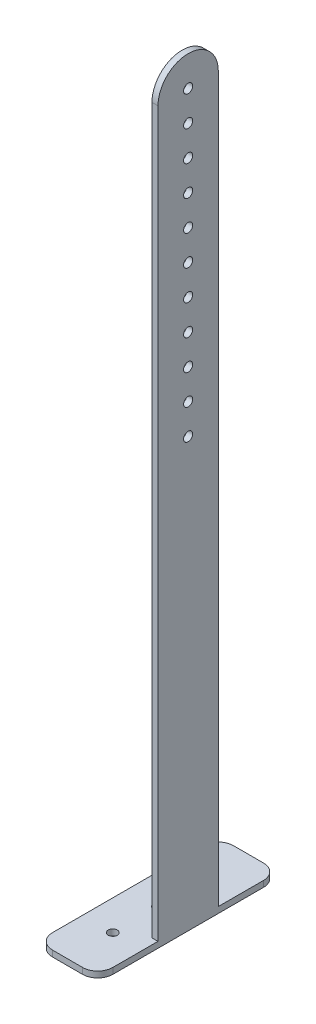
ISO-10303-21;
HEADER;
FILE_DESCRIPTION(('STEP AP214'),'2;1');
FILE_NAME('part.step','',(''),(''),'','','');
FILE_SCHEMA(('AUTOMOTIVE_DESIGN { 1 0 10303 214 1 1 1 1 }'));
ENDSEC;
DATA;
#1=APPLICATION_CONTEXT('core data for automotive mechanical design processes');
#2=APPLICATION_PROTOCOL_DEFINITION('international standard','automotive_design',2000,#1);
#3=PRODUCT_CONTEXT('',#1,'mechanical');
#4=PRODUCT('Part','Part','',(#3));
#5=PRODUCT_RELATED_PRODUCT_CATEGORY('part','',(#4));
#6=PRODUCT_DEFINITION_FORMATION('','',#4);
#7=PRODUCT_DEFINITION_CONTEXT('part definition',#1,'design');
#8=PRODUCT_DEFINITION('design','',#6,#7);
#9=PRODUCT_DEFINITION_SHAPE('','',#8);
#10=(LENGTH_UNIT() NAMED_UNIT(*) SI_UNIT(.MILLI.,.METRE.));
#11=(NAMED_UNIT(*) PLANE_ANGLE_UNIT() SI_UNIT($,.RADIAN.));
#12=(NAMED_UNIT(*) SI_UNIT($,.STERADIAN.) SOLID_ANGLE_UNIT());
#13=UNCERTAINTY_MEASURE_WITH_UNIT(LENGTH_MEASURE(1.E-05),#10,'distance_accuracy_value','');
#14=(GEOMETRIC_REPRESENTATION_CONTEXT(3) GLOBAL_UNCERTAINTY_ASSIGNED_CONTEXT((#13)) GLOBAL_UNIT_ASSIGNED_CONTEXT((#10,
#11,#12)) REPRESENTATION_CONTEXT('',''));
#15=CARTESIAN_POINT('',(0.,0.,0.));
#16=DIRECTION('',(0.,0.,1.));
#17=DIRECTION('',(1.,0.,0.));
#18=AXIS2_PLACEMENT_3D('',#15,#16,#17);
#19=CARTESIAN_POINT('',(0.,240.,10.));
#20=DIRECTION('',(-1.,0.,0.));
#21=DIRECTION('',(0.,0.,1.));
#22=AXIS2_PLACEMENT_3D('',#19,#20,#21);
#23=CYLINDRICAL_SURFACE('',#22,10.);
#24=DIRECTION('',(1.,0.,0.));
#25=VECTOR('',#24,1.);
#26=CARTESIAN_POINT('',(0.,240.,0.));
#27=LINE('',#26,#25);
#28=CARTESIAN_POINT('',(0.,240.,0.));
#29=VERTEX_POINT('',#28);
#30=CARTESIAN_POINT('',(2.,240.,0.));
#31=VERTEX_POINT('',#30);
#32=EDGE_CURVE('E190',#29,#31,#27,.T.);
#33=ORIENTED_EDGE('',*,*,#32,.F.);
#34=CARTESIAN_POINT('',(0.,240.,10.));
#35=DIRECTION('',(1.,0.,0.));
#36=DIRECTION('',(0.,0.,-1.));
#37=AXIS2_PLACEMENT_3D('',#34,#35,#36);
#38=CIRCLE('',#37,10.);
#39=CARTESIAN_POINT('',(0.,240.,20.));
#40=VERTEX_POINT('',#39);
#41=EDGE_CURVE('E47',#40,#29,#38,.F.);
#42=ORIENTED_EDGE('',*,*,#41,.F.);
#43=DIRECTION('',(-1.,0.,0.));
#44=VECTOR('',#43,1.);
#45=CARTESIAN_POINT('',(0.,240.,20.));
#46=LINE('',#45,#44);
#47=CARTESIAN_POINT('',(2.,240.,20.));
#48=VERTEX_POINT('',#47);
#49=EDGE_CURVE('E192',#48,#40,#46,.T.);
#50=ORIENTED_EDGE('',*,*,#49,.F.);
#51=CARTESIAN_POINT('',(2.,240.,10.));
#52=DIRECTION('',(-1.,0.,0.));
#53=DIRECTION('',(0.,0.,1.));
#54=AXIS2_PLACEMENT_3D('',#51,#52,#53);
#55=CIRCLE('',#54,10.);
#56=EDGE_CURVE('E11',#31,#48,#55,.F.);
#57=ORIENTED_EDGE('',*,*,#56,.F.);
#58=EDGE_LOOP('',(#33,#42,#50,#57));
#59=FACE_BOUND('',#58,.T.);
#60=ADVANCED_FACE('F39',(#59),#23,.T.);
#61=CARTESIAN_POINT('',(2.,250.,20.));
#62=DIRECTION('',(-1.,0.,0.));
#63=DIRECTION('',(0.,0.,1.));
#64=AXIS2_PLACEMENT_3D('',#61,#62,#63);
#65=PLANE('',#64);
#66=CARTESIAN_POINT('',(2.,240.,10.));
#67=DIRECTION('',(-1.,0.,0.));
#68=DIRECTION('',(0.,0.,1.));
#69=AXIS2_PLACEMENT_3D('',#66,#67,#68);
#70=CIRCLE('',#69,1.51);
#71=CARTESIAN_POINT('',(2.,240.,11.51));
#72=VERTEX_POINT('',#71);
#73=EDGE_CURVE('E228',#72,#72,#70,.T.);
#74=ORIENTED_EDGE('',*,*,#73,.T.);
#75=EDGE_LOOP('',(#74));
#76=FACE_BOUND('',#75,.T.);
#77=CARTESIAN_POINT('',(2.,230.,10.0000000000001));
#78=DIRECTION('',(-1.,0.,0.));
#79=DIRECTION('',(0.,0.,1.));
#80=AXIS2_PLACEMENT_3D('',#77,#78,#79);
#81=CIRCLE('',#80,1.51);
#82=CARTESIAN_POINT('',(2.,230.,11.5100000000001));
#83=VERTEX_POINT('',#82);
#84=EDGE_CURVE('E299',#83,#83,#81,.T.);
#85=ORIENTED_EDGE('',*,*,#84,.T.);
#86=EDGE_LOOP('',(#85));
#87=FACE_BOUND('',#86,.T.);
#88=CARTESIAN_POINT('',(2.,220.,10.0000000000002));
#89=DIRECTION('',(-1.,0.,0.));
#90=DIRECTION('',(0.,0.,1.));
#91=AXIS2_PLACEMENT_3D('',#88,#89,#90);
#92=CIRCLE('',#91,1.51);
#93=CARTESIAN_POINT('',(2.,220.,11.5100000000002));
#94=VERTEX_POINT('',#93);
#95=EDGE_CURVE('E293',#94,#94,#92,.T.);
#96=ORIENTED_EDGE('',*,*,#95,.T.);
#97=EDGE_LOOP('',(#96));
#98=FACE_BOUND('',#97,.T.);
#99=CARTESIAN_POINT('',(2.,210.,10.0000000000003));
#100=DIRECTION('',(-1.,0.,0.));
#101=DIRECTION('',(0.,0.,1.));
#102=AXIS2_PLACEMENT_3D('',#99,#100,#101);
#103=CIRCLE('',#102,1.51);
#104=CARTESIAN_POINT('',(2.,210.,11.5100000000003));
#105=VERTEX_POINT('',#104);
#106=EDGE_CURVE('E287',#105,#105,#103,.T.);
#107=ORIENTED_EDGE('',*,*,#106,.T.);
#108=EDGE_LOOP('',(#107));
#109=FACE_BOUND('',#108,.T.);
#110=CARTESIAN_POINT('',(2.,200.,10.000000000001));
#111=DIRECTION('',(-1.,0.,0.));
#112=DIRECTION('',(0.,0.,1.));
#113=AXIS2_PLACEMENT_3D('',#110,#111,#112);
#114=CIRCLE('',#113,1.51);
#115=CARTESIAN_POINT('',(2.,200.,11.510000000001));
#116=VERTEX_POINT('',#115);
#117=EDGE_CURVE('E281',#116,#116,#114,.T.);
#118=ORIENTED_EDGE('',*,*,#117,.T.);
#119=EDGE_LOOP('',(#118));
#120=FACE_BOUND('',#119,.T.);
#121=CARTESIAN_POINT('',(2.,190.,10.0000000000012));
#122=DIRECTION('',(-1.,0.,0.));
#123=DIRECTION('',(0.,0.,1.));
#124=AXIS2_PLACEMENT_3D('',#121,#122,#123);
#125=CIRCLE('',#124,1.51);
#126=CARTESIAN_POINT('',(2.,190.,11.5100000000012));
#127=VERTEX_POINT('',#126);
#128=EDGE_CURVE('E275',#127,#127,#125,.T.);
#129=ORIENTED_EDGE('',*,*,#128,.T.);
#130=EDGE_LOOP('',(#129));
#131=FACE_BOUND('',#130,.T.);
#132=CARTESIAN_POINT('',(2.,180.,10.0000000000015));
#133=DIRECTION('',(-1.,0.,0.));
#134=DIRECTION('',(0.,0.,1.));
#135=AXIS2_PLACEMENT_3D('',#132,#133,#134);
#136=CIRCLE('',#135,1.51);
#137=CARTESIAN_POINT('',(2.,180.,11.5100000000015));
#138=VERTEX_POINT('',#137);
#139=EDGE_CURVE('E269',#138,#138,#136,.T.);
#140=ORIENTED_EDGE('',*,*,#139,.T.);
#141=EDGE_LOOP('',(#140));
#142=FACE_BOUND('',#141,.T.);
#143=CARTESIAN_POINT('',(2.,170.,10.0000000000027));
#144=DIRECTION('',(-1.,0.,0.));
#145=DIRECTION('',(0.,0.,1.));
#146=AXIS2_PLACEMENT_3D('',#143,#144,#145);
#147=CIRCLE('',#146,1.50999999999999);
#148=CARTESIAN_POINT('',(2.,170.,11.5100000000027));
#149=VERTEX_POINT('',#148);
#150=EDGE_CURVE('E263',#149,#149,#147,.T.);
#151=ORIENTED_EDGE('',*,*,#150,.T.);
#152=EDGE_LOOP('',(#151));
#153=FACE_BOUND('',#152,.T.);
#154=CARTESIAN_POINT('',(2.,160.,10.0000000000031));
#155=DIRECTION('',(-1.,0.,0.));
#156=DIRECTION('',(0.,0.,1.));
#157=AXIS2_PLACEMENT_3D('',#154,#155,#156);
#158=CIRCLE('',#157,1.51);
#159=CARTESIAN_POINT('',(2.,160.,11.5100000000031));
#160=VERTEX_POINT('',#159);
#161=EDGE_CURVE('E257',#160,#160,#158,.T.);
#162=ORIENTED_EDGE('',*,*,#161,.T.);
#163=EDGE_LOOP('',(#162));
#164=FACE_BOUND('',#163,.T.);
#165=CARTESIAN_POINT('',(2.,150.,10.0000000000035));
#166=DIRECTION('',(-1.,0.,0.));
#167=DIRECTION('',(0.,0.,1.));
#168=AXIS2_PLACEMENT_3D('',#165,#166,#167);
#169=CIRCLE('',#168,1.51);
#170=CARTESIAN_POINT('',(2.,150.,11.5100000000035));
#171=VERTEX_POINT('',#170);
#172=EDGE_CURVE('E251',#171,#171,#169,.T.);
#173=ORIENTED_EDGE('',*,*,#172,.T.);
#174=EDGE_LOOP('',(#173));
#175=FACE_BOUND('',#174,.T.);
#176=CARTESIAN_POINT('',(2.,140.,10.0000000000039));
#177=DIRECTION('',(-1.,0.,0.));
#178=DIRECTION('',(0.,0.,1.));
#179=AXIS2_PLACEMENT_3D('',#176,#177,#178);
#180=CIRCLE('',#179,1.51);
#181=CARTESIAN_POINT('',(2.,140.,11.5100000000039));
#182=VERTEX_POINT('',#181);
#183=EDGE_CURVE('E245',#182,#182,#180,.T.);
#184=ORIENTED_EDGE('',*,*,#183,.T.);
#185=EDGE_LOOP('',(#184));
#186=FACE_BOUND('',#185,.T.);
#187=DIRECTION('',(0.,1.,0.));
#188=VECTOR('',#187,1.);
#189=CARTESIAN_POINT('',(2.,250.,0.));
#190=LINE('',#189,#188);
#191=CARTESIAN_POINT('',(2.,0.,0.));
#192=VERTEX_POINT('',#191);
#193=EDGE_CURVE('E136',#192,#31,#190,.T.);
#194=ORIENTED_EDGE('',*,*,#193,.T.);
#195=ORIENTED_EDGE('',*,*,#56,.T.);
#196=DIRECTION('',(0.,1.,0.));
#197=VECTOR('',#196,1.);
#198=CARTESIAN_POINT('',(2.,250.,20.));
#199=LINE('',#198,#197);
#200=CARTESIAN_POINT('',(2.,0.,20.));
#201=VERTEX_POINT('',#200);
#202=EDGE_CURVE('E154',#201,#48,#199,.T.);
#203=ORIENTED_EDGE('',*,*,#202,.F.);
#204=DIRECTION('',(0.,0.,-1.));
#205=VECTOR('',#204,1.);
#206=CARTESIAN_POINT('',(2.,0.,40.));
#207=LINE('',#206,#205);
#208=CARTESIAN_POINT('',(2.,0.,35.));
#209=VERTEX_POINT('',#208);
#210=EDGE_CURVE('E201',#209,#201,#207,.T.);
#211=ORIENTED_EDGE('',*,*,#210,.F.);
#212=DIRECTION('',(0.,-1.,0.));
#213=VECTOR('',#212,1.);
#214=CARTESIAN_POINT('',(2.,250.,35.));
#215=LINE('',#214,#213);
#216=CARTESIAN_POINT('',(2.,-2.,35.));
#217=VERTEX_POINT('',#216);
#218=EDGE_CURVE('E168',#209,#217,#215,.T.);
#219=ORIENTED_EDGE('',*,*,#218,.T.);
#220=DIRECTION('',(0.,0.,-1.));
#221=VECTOR('',#220,1.);
#222=CARTESIAN_POINT('',(2.,-2.,40.));
#223=LINE('',#222,#221);
#224=CARTESIAN_POINT('',(2.,-2.,-15.));
#225=VERTEX_POINT('',#224);
#226=EDGE_CURVE('E203',#217,#225,#223,.T.);
#227=ORIENTED_EDGE('',*,*,#226,.T.);
#228=DIRECTION('',(0.,-1.,0.));
#229=VECTOR('',#228,1.);
#230=CARTESIAN_POINT('',(2.,0.,-15.));
#231=LINE('',#230,#229);
#232=CARTESIAN_POINT('',(2.,0.,-15.));
#233=VERTEX_POINT('',#232);
#234=EDGE_CURVE('E171',#225,#233,#231,.F.);
#235=ORIENTED_EDGE('',*,*,#234,.T.);
#236=EDGE_CURVE('E197',#192,#233,#207,.T.);
#237=ORIENTED_EDGE('',*,*,#236,.F.);
#238=EDGE_LOOP('',(#194,#195,#203,#211,#219,#227,#235,#237));
#239=FACE_BOUND('',#238,.T.);
#240=ADVANCED_FACE('F196',(#76,#87,#98,#109,#120,#131,#142,#153,#164,#175,#186,#239),#65,.F.);
#241=CARTESIAN_POINT('',(0.,0.,20.));
#242=DIRECTION('',(1.,0.,0.));
#243=DIRECTION('',(0.,0.,-1.));
#244=AXIS2_PLACEMENT_3D('',#241,#242,#243);
#245=PLANE('',#244);
#246=CARTESIAN_POINT('',(0.,240.,10.));
#247=DIRECTION('',(-1.,0.,0.));
#248=DIRECTION('',(0.,0.,1.));
#249=AXIS2_PLACEMENT_3D('',#246,#247,#248);
#250=CIRCLE('',#249,1.51);
#251=CARTESIAN_POINT('',(0.,240.,11.51));
#252=VERTEX_POINT('',#251);
#253=EDGE_CURVE('E302',#252,#252,#250,.T.);
#254=ORIENTED_EDGE('',*,*,#253,.F.);
#255=EDGE_LOOP('',(#254));
#256=FACE_BOUND('',#255,.T.);
#257=CARTESIAN_POINT('',(0.,230.,10.0000000000001));
#258=DIRECTION('',(-1.,0.,0.));
#259=DIRECTION('',(0.,0.,1.));
#260=AXIS2_PLACEMENT_3D('',#257,#258,#259);
#261=CIRCLE('',#260,1.51);
#262=CARTESIAN_POINT('',(0.,230.,11.5100000000001));
#263=VERTEX_POINT('',#262);
#264=EDGE_CURVE('E296',#263,#263,#261,.T.);
#265=ORIENTED_EDGE('',*,*,#264,.F.);
#266=EDGE_LOOP('',(#265));
#267=FACE_BOUND('',#266,.T.);
#268=CARTESIAN_POINT('',(0.,220.,10.0000000000002));
#269=DIRECTION('',(-1.,0.,0.));
#270=DIRECTION('',(0.,0.,1.));
#271=AXIS2_PLACEMENT_3D('',#268,#269,#270);
#272=CIRCLE('',#271,1.51);
#273=CARTESIAN_POINT('',(0.,220.,11.5100000000002));
#274=VERTEX_POINT('',#273);
#275=EDGE_CURVE('E290',#274,#274,#272,.T.);
#276=ORIENTED_EDGE('',*,*,#275,.F.);
#277=EDGE_LOOP('',(#276));
#278=FACE_BOUND('',#277,.T.);
#279=CARTESIAN_POINT('',(0.,210.,10.0000000000003));
#280=DIRECTION('',(-1.,0.,0.));
#281=DIRECTION('',(0.,0.,1.));
#282=AXIS2_PLACEMENT_3D('',#279,#280,#281);
#283=CIRCLE('',#282,1.51);
#284=CARTESIAN_POINT('',(0.,210.,11.5100000000003));
#285=VERTEX_POINT('',#284);
#286=EDGE_CURVE('E284',#285,#285,#283,.T.);
#287=ORIENTED_EDGE('',*,*,#286,.F.);
#288=EDGE_LOOP('',(#287));
#289=FACE_BOUND('',#288,.T.);
#290=CARTESIAN_POINT('',(0.,200.,10.000000000001));
#291=DIRECTION('',(-1.,0.,0.));
#292=DIRECTION('',(0.,0.,1.));
#293=AXIS2_PLACEMENT_3D('',#290,#291,#292);
#294=CIRCLE('',#293,1.51);
#295=CARTESIAN_POINT('',(0.,200.,11.510000000001));
#296=VERTEX_POINT('',#295);
#297=EDGE_CURVE('E278',#296,#296,#294,.T.);
#298=ORIENTED_EDGE('',*,*,#297,.F.);
#299=EDGE_LOOP('',(#298));
#300=FACE_BOUND('',#299,.T.);
#301=CARTESIAN_POINT('',(0.,190.,10.0000000000012));
#302=DIRECTION('',(-1.,0.,0.));
#303=DIRECTION('',(0.,0.,1.));
#304=AXIS2_PLACEMENT_3D('',#301,#302,#303);
#305=CIRCLE('',#304,1.51);
#306=CARTESIAN_POINT('',(0.,190.,11.5100000000012));
#307=VERTEX_POINT('',#306);
#308=EDGE_CURVE('E272',#307,#307,#305,.T.);
#309=ORIENTED_EDGE('',*,*,#308,.F.);
#310=EDGE_LOOP('',(#309));
#311=FACE_BOUND('',#310,.T.);
#312=CARTESIAN_POINT('',(0.,180.,10.0000000000015));
#313=DIRECTION('',(-1.,0.,0.));
#314=DIRECTION('',(0.,0.,1.));
#315=AXIS2_PLACEMENT_3D('',#312,#313,#314);
#316=CIRCLE('',#315,1.51);
#317=CARTESIAN_POINT('',(0.,180.,11.5100000000015));
#318=VERTEX_POINT('',#317);
#319=EDGE_CURVE('E266',#318,#318,#316,.T.);
#320=ORIENTED_EDGE('',*,*,#319,.F.);
#321=EDGE_LOOP('',(#320));
#322=FACE_BOUND('',#321,.T.);
#323=CARTESIAN_POINT('',(0.,170.,10.0000000000027));
#324=DIRECTION('',(-1.,0.,0.));
#325=DIRECTION('',(0.,0.,1.));
#326=AXIS2_PLACEMENT_3D('',#323,#324,#325);
#327=CIRCLE('',#326,1.50999999999999);
#328=CARTESIAN_POINT('',(0.,170.,11.5100000000027));
#329=VERTEX_POINT('',#328);
#330=EDGE_CURVE('E260',#329,#329,#327,.T.);
#331=ORIENTED_EDGE('',*,*,#330,.F.);
#332=EDGE_LOOP('',(#331));
#333=FACE_BOUND('',#332,.T.);
#334=CARTESIAN_POINT('',(0.,160.,10.0000000000031));
#335=DIRECTION('',(-1.,0.,0.));
#336=DIRECTION('',(0.,0.,1.));
#337=AXIS2_PLACEMENT_3D('',#334,#335,#336);
#338=CIRCLE('',#337,1.51);
#339=CARTESIAN_POINT('',(0.,160.,11.5100000000031));
#340=VERTEX_POINT('',#339);
#341=EDGE_CURVE('E254',#340,#340,#338,.T.);
#342=ORIENTED_EDGE('',*,*,#341,.F.);
#343=EDGE_LOOP('',(#342));
#344=FACE_BOUND('',#343,.T.);
#345=CARTESIAN_POINT('',(0.,150.,10.0000000000035));
#346=DIRECTION('',(-1.,0.,0.));
#347=DIRECTION('',(0.,0.,1.));
#348=AXIS2_PLACEMENT_3D('',#345,#346,#347);
#349=CIRCLE('',#348,1.51);
#350=CARTESIAN_POINT('',(0.,150.,11.5100000000035));
#351=VERTEX_POINT('',#350);
#352=EDGE_CURVE('E248',#351,#351,#349,.T.);
#353=ORIENTED_EDGE('',*,*,#352,.F.);
#354=EDGE_LOOP('',(#353));
#355=FACE_BOUND('',#354,.T.);
#356=CARTESIAN_POINT('',(0.,140.,10.0000000000039));
#357=DIRECTION('',(-1.,0.,0.));
#358=DIRECTION('',(0.,0.,1.));
#359=AXIS2_PLACEMENT_3D('',#356,#357,#358);
#360=CIRCLE('',#359,1.51);
#361=CARTESIAN_POINT('',(0.,140.,11.5100000000039));
#362=VERTEX_POINT('',#361);
#363=EDGE_CURVE('E242',#362,#362,#360,.T.);
#364=ORIENTED_EDGE('',*,*,#363,.F.);
#365=EDGE_LOOP('',(#364));
#366=FACE_BOUND('',#365,.T.);
#367=DIRECTION('',(0.,-1.,0.));
#368=VECTOR('',#367,1.);
#369=CARTESIAN_POINT('',(0.,0.,20.));
#370=LINE('',#369,#368);
#371=CARTESIAN_POINT('',(0.,0.,20.));
#372=VERTEX_POINT('',#371);
#373=EDGE_CURVE('E149',#40,#372,#370,.T.);
#374=ORIENTED_EDGE('',*,*,#373,.F.);
#375=ORIENTED_EDGE('',*,*,#41,.T.);
#376=DIRECTION('',(0.,-1.,0.));
#377=VECTOR('',#376,1.);
#378=CARTESIAN_POINT('',(0.,0.,0.));
#379=LINE('',#378,#377);
#380=CARTESIAN_POINT('',(0.,0.,0.));
#381=VERTEX_POINT('',#380);
#382=EDGE_CURVE('E126',#29,#381,#379,.T.);
#383=ORIENTED_EDGE('',*,*,#382,.T.);
#384=DIRECTION('',(0.,0.,-1.));
#385=VECTOR('',#384,1.);
#386=CARTESIAN_POINT('',(0.,0.,20.));
#387=LINE('',#386,#385);
#388=EDGE_CURVE('E131',#372,#381,#387,.T.);
#389=ORIENTED_EDGE('',*,*,#388,.F.);
#390=EDGE_LOOP('',(#374,#375,#383,#389));
#391=FACE_BOUND('',#390,.T.);
#392=ADVANCED_FACE('F129',(#256,#267,#278,#289,#300,#311,#322,#333,#344,#355,#366,#391),#245,.F.);
#393=CARTESIAN_POINT('',(0.,0.,20.));
#394=DIRECTION('',(0.,0.,-1.));
#395=DIRECTION('',(-1.,0.,0.));
#396=AXIS2_PLACEMENT_3D('',#393,#394,#395);
#397=PLANE('',#396);
#398=ORIENTED_EDGE('',*,*,#202,.T.);
#399=ORIENTED_EDGE('',*,*,#49,.T.);
#400=ORIENTED_EDGE('',*,*,#373,.T.);
#401=DIRECTION('',(1.,0.,0.));
#402=VECTOR('',#401,1.);
#403=CARTESIAN_POINT('',(2.,0.,20.));
#404=LINE('',#403,#402);
#405=EDGE_CURVE('E135',#372,#201,#404,.T.);
#406=ORIENTED_EDGE('',*,*,#405,.T.);
#407=EDGE_LOOP('',(#398,#399,#400,#406));
#408=FACE_BOUND('',#407,.T.);
#409=ADVANCED_FACE('F195',(#408),#397,.F.);
#410=CARTESIAN_POINT('',(0.,0.,0.));
#411=DIRECTION('',(0.,0.,-1.));
#412=DIRECTION('',(-1.,0.,0.));
#413=AXIS2_PLACEMENT_3D('',#410,#411,#412);
#414=PLANE('',#413);
#415=ORIENTED_EDGE('',*,*,#382,.F.);
#416=ORIENTED_EDGE('',*,*,#32,.T.);
#417=ORIENTED_EDGE('',*,*,#193,.F.);
#418=DIRECTION('',(1.,0.,0.));
#419=VECTOR('',#418,1.);
#420=CARTESIAN_POINT('',(2.,0.,0.));
#421=LINE('',#420,#419);
#422=EDGE_CURVE('E139',#381,#192,#421,.T.);
#423=ORIENTED_EDGE('',*,*,#422,.F.);
#424=EDGE_LOOP('',(#415,#416,#417,#423));
#425=FACE_BOUND('',#424,.T.);
#426=ADVANCED_FACE('F140',(#425),#414,.T.);
#427=CARTESIAN_POINT('',(-18.,0.,40.));
#428=DIRECTION('',(0.,1.,0.));
#429=DIRECTION('',(0.,0.,1.));
#430=AXIS2_PLACEMENT_3D('',#427,#428,#429);
#431=PLANE('',#430);
#432=CARTESIAN_POINT('',(-8.,0.,25.));
#433=DIRECTION('',(0.,1.,0.));
#434=DIRECTION('',(0.,0.,1.));
#435=AXIS2_PLACEMENT_3D('',#432,#433,#434);
#436=CIRCLE('',#435,1.51);
#437=CARTESIAN_POINT('',(-8.,0.,26.51));
#438=VERTEX_POINT('',#437);
#439=EDGE_CURVE('E237',#438,#438,#436,.T.);
#440=ORIENTED_EDGE('',*,*,#439,.F.);
#441=EDGE_LOOP('',(#440));
#442=FACE_BOUND('',#441,.T.);
#443=CARTESIAN_POINT('',(-8.,0.,10.));
#444=DIRECTION('',(0.,1.,0.));
#445=DIRECTION('',(0.,0.,1.));
#446=AXIS2_PLACEMENT_3D('',#443,#444,#445);
#447=CIRCLE('',#446,1.51);
#448=CARTESIAN_POINT('',(-8.,0.,11.51));
#449=VERTEX_POINT('',#448);
#450=EDGE_CURVE('E231',#449,#449,#447,.T.);
#451=ORIENTED_EDGE('',*,*,#450,.F.);
#452=EDGE_LOOP('',(#451));
#453=FACE_BOUND('',#452,.T.);
#454=CARTESIAN_POINT('',(-8.,0.,-5.));
#455=DIRECTION('',(0.,1.,0.));
#456=DIRECTION('',(0.,0.,-1.));
#457=AXIS2_PLACEMENT_3D('',#454,#455,#456);
#458=CIRCLE('',#457,1.51);
#459=CARTESIAN_POINT('',(-8.,0.,-6.51000000000001));
#460=VERTEX_POINT('',#459);
#461=EDGE_CURVE('E224',#460,#460,#458,.T.);
#462=ORIENTED_EDGE('',*,*,#461,.F.);
#463=EDGE_LOOP('',(#462));
#464=FACE_BOUND('',#463,.T.);
#465=ORIENTED_EDGE('',*,*,#236,.T.);
#466=CARTESIAN_POINT('',(-3.,0.,-15.));
#467=DIRECTION('',(0.,1.,0.));
#468=DIRECTION('',(0.,0.,1.));
#469=AXIS2_PLACEMENT_3D('',#466,#467,#468);
#470=CIRCLE('',#469,5.);
#471=CARTESIAN_POINT('',(-3.,0.,-20.));
#472=VERTEX_POINT('',#471);
#473=EDGE_CURVE('E179',#233,#472,#470,.T.);
#474=ORIENTED_EDGE('',*,*,#473,.T.);
#475=DIRECTION('',(1.,0.,0.));
#476=VECTOR('',#475,1.);
#477=CARTESIAN_POINT('',(-18.,0.,-20.));
#478=LINE('',#477,#476);
#479=CARTESIAN_POINT('',(-13.,0.,-20.));
#480=VERTEX_POINT('',#479);
#481=EDGE_CURVE('E220',#480,#472,#478,.T.);
#482=ORIENTED_EDGE('',*,*,#481,.F.);
#483=CARTESIAN_POINT('',(-13.,0.,-15.));
#484=DIRECTION('',(0.,1.,0.));
#485=DIRECTION('',(0.,0.,1.));
#486=AXIS2_PLACEMENT_3D('',#483,#484,#485);
#487=CIRCLE('',#486,5.);
#488=CARTESIAN_POINT('',(-18.,0.,-15.));
#489=VERTEX_POINT('',#488);
#490=EDGE_CURVE('E177',#480,#489,#487,.T.);
#491=ORIENTED_EDGE('',*,*,#490,.T.);
#492=DIRECTION('',(0.,0.,-1.));
#493=VECTOR('',#492,1.);
#494=CARTESIAN_POINT('',(-18.,0.,40.));
#495=LINE('',#494,#493);
#496=CARTESIAN_POINT('',(-18.,0.,35.));
#497=VERTEX_POINT('',#496);
#498=EDGE_CURVE('E144',#497,#489,#495,.T.);
#499=ORIENTED_EDGE('',*,*,#498,.F.);
#500=CARTESIAN_POINT('',(-13.,0.,35.));
#501=DIRECTION('',(0.,1.,0.));
#502=DIRECTION('',(0.,0.,1.));
#503=AXIS2_PLACEMENT_3D('',#500,#501,#502);
#504=CIRCLE('',#503,5.);
#505=CARTESIAN_POINT('',(-13.,0.,40.));
#506=VERTEX_POINT('',#505);
#507=EDGE_CURVE('E173',#497,#506,#504,.T.);
#508=ORIENTED_EDGE('',*,*,#507,.T.);
#509=DIRECTION('',(1.,0.,0.));
#510=VECTOR('',#509,1.);
#511=CARTESIAN_POINT('',(-18.,0.,40.));
#512=LINE('',#511,#510);
#513=CARTESIAN_POINT('',(-3.,0.,40.));
#514=VERTEX_POINT('',#513);
#515=EDGE_CURVE('E214',#506,#514,#512,.T.);
#516=ORIENTED_EDGE('',*,*,#515,.T.);
#517=CARTESIAN_POINT('',(-3.,0.,35.));
#518=DIRECTION('',(0.,1.,0.));
#519=DIRECTION('',(0.,0.,1.));
#520=AXIS2_PLACEMENT_3D('',#517,#518,#519);
#521=CIRCLE('',#520,5.);
#522=EDGE_CURVE('E175',#514,#209,#521,.T.);
#523=ORIENTED_EDGE('',*,*,#522,.T.);
#524=ORIENTED_EDGE('',*,*,#210,.T.);
#525=ORIENTED_EDGE('',*,*,#405,.F.);
#526=ORIENTED_EDGE('',*,*,#388,.T.);
#527=ORIENTED_EDGE('',*,*,#422,.T.);
#528=EDGE_LOOP('',(#465,#474,#482,#491,#499,#508,#516,#523,#524,#525,#526,#527));
#529=FACE_BOUND('',#528,.T.);
#530=ADVANCED_FACE('F146',(#442,#453,#464,#529),#431,.T.);
#531=CARTESIAN_POINT('',(-18.,-2.,40.));
#532=DIRECTION('',(-1.,0.,0.));
#533=DIRECTION('',(0.,0.,1.));
#534=AXIS2_PLACEMENT_3D('',#531,#532,#533);
#535=PLANE('',#534);
#536=ORIENTED_EDGE('',*,*,#498,.T.);
#537=DIRECTION('',(0.,1.,0.));
#538=VECTOR('',#537,1.);
#539=CARTESIAN_POINT('',(-18.,-2.,-15.));
#540=LINE('',#539,#538);
#541=CARTESIAN_POINT('',(-18.,-2.,-15.));
#542=VERTEX_POINT('',#541);
#543=EDGE_CURVE('E184',#489,#542,#540,.F.);
#544=ORIENTED_EDGE('',*,*,#543,.T.);
#545=DIRECTION('',(0.,0.,-1.));
#546=VECTOR('',#545,1.);
#547=CARTESIAN_POINT('',(-18.,-2.,40.));
#548=LINE('',#547,#546);
#549=CARTESIAN_POINT('',(-18.,-2.,35.));
#550=VERTEX_POINT('',#549);
#551=EDGE_CURVE('E206',#550,#542,#548,.T.);
#552=ORIENTED_EDGE('',*,*,#551,.F.);
#553=DIRECTION('',(0.,1.,0.));
#554=VECTOR('',#553,1.);
#555=CARTESIAN_POINT('',(-18.,0.,35.));
#556=LINE('',#555,#554);
#557=EDGE_CURVE('E181',#550,#497,#556,.T.);
#558=ORIENTED_EDGE('',*,*,#557,.T.);
#559=EDGE_LOOP('',(#536,#544,#552,#558));
#560=FACE_BOUND('',#559,.T.);
#561=ADVANCED_FACE('F399',(#560),#535,.T.);
#562=CARTESIAN_POINT('',(2.,-2.,40.));
#563=DIRECTION('',(0.,-1.,0.));
#564=DIRECTION('',(0.,0.,-1.));
#565=AXIS2_PLACEMENT_3D('',#562,#563,#564);
#566=PLANE('',#565);
#567=CARTESIAN_POINT('',(-8.,-2.,25.));
#568=DIRECTION('',(0.,1.,0.));
#569=DIRECTION('',(0.,0.,1.));
#570=AXIS2_PLACEMENT_3D('',#567,#568,#569);
#571=CIRCLE('',#570,1.51);
#572=CARTESIAN_POINT('',(-8.,-2.,26.51));
#573=VERTEX_POINT('',#572);
#574=EDGE_CURVE('E223',#573,#573,#571,.T.);
#575=ORIENTED_EDGE('',*,*,#574,.T.);
#576=EDGE_LOOP('',(#575));
#577=FACE_BOUND('',#576,.T.);
#578=CARTESIAN_POINT('',(-8.,-2.,10.));
#579=DIRECTION('',(0.,1.,0.));
#580=DIRECTION('',(0.,0.,1.));
#581=AXIS2_PLACEMENT_3D('',#578,#579,#580);
#582=CIRCLE('',#581,1.51);
#583=CARTESIAN_POINT('',(-8.,-2.,11.51));
#584=VERTEX_POINT('',#583);
#585=EDGE_CURVE('E234',#584,#584,#582,.T.);
#586=ORIENTED_EDGE('',*,*,#585,.T.);
#587=EDGE_LOOP('',(#586));
#588=FACE_BOUND('',#587,.T.);
#589=CARTESIAN_POINT('',(-8.,-2.,-5.));
#590=DIRECTION('',(0.,1.,0.));
#591=DIRECTION('',(0.,0.,-1.));
#592=AXIS2_PLACEMENT_3D('',#589,#590,#591);
#593=CIRCLE('',#592,1.51);
#594=CARTESIAN_POINT('',(-8.,-2.,-6.51000000000001));
#595=VERTEX_POINT('',#594);
#596=EDGE_CURVE('E227',#595,#595,#593,.T.);
#597=ORIENTED_EDGE('',*,*,#596,.T.);
#598=EDGE_LOOP('',(#597));
#599=FACE_BOUND('',#598,.T.);
#600=DIRECTION('',(-1.,0.,0.));
#601=VECTOR('',#600,1.);
#602=CARTESIAN_POINT('',(2.,-2.,-20.));
#603=LINE('',#602,#601);
#604=CARTESIAN_POINT('',(-3.,-2.,-20.));
#605=VERTEX_POINT('',#604);
#606=CARTESIAN_POINT('',(-13.,-2.,-20.));
#607=VERTEX_POINT('',#606);
#608=EDGE_CURVE('E217',#605,#607,#603,.T.);
#609=ORIENTED_EDGE('',*,*,#608,.F.);
#610=CARTESIAN_POINT('',(-3.,-2.,-15.));
#611=DIRECTION('',(0.,-1.,0.));
#612=DIRECTION('',(0.,0.,-1.));
#613=AXIS2_PLACEMENT_3D('',#610,#611,#612);
#614=CIRCLE('',#613,5.);
#615=EDGE_CURVE('E166',#605,#225,#614,.T.);
#616=ORIENTED_EDGE('',*,*,#615,.T.);
#617=ORIENTED_EDGE('',*,*,#226,.F.);
#618=CARTESIAN_POINT('',(-3.,-2.,35.));
#619=DIRECTION('',(0.,-1.,0.));
#620=DIRECTION('',(0.,0.,-1.));
#621=AXIS2_PLACEMENT_3D('',#618,#619,#620);
#622=CIRCLE('',#621,5.);
#623=CARTESIAN_POINT('',(-3.,-2.,40.));
#624=VERTEX_POINT('',#623);
#625=EDGE_CURVE('E162',#217,#624,#622,.T.);
#626=ORIENTED_EDGE('',*,*,#625,.T.);
#627=DIRECTION('',(-1.,0.,0.));
#628=VECTOR('',#627,1.);
#629=CARTESIAN_POINT('',(2.,-2.,40.));
#630=LINE('',#629,#628);
#631=CARTESIAN_POINT('',(-13.,-2.,40.));
#632=VERTEX_POINT('',#631);
#633=EDGE_CURVE('E211',#624,#632,#630,.T.);
#634=ORIENTED_EDGE('',*,*,#633,.T.);
#635=CARTESIAN_POINT('',(-13.,-2.,35.));
#636=DIRECTION('',(0.,-1.,0.));
#637=DIRECTION('',(0.,0.,-1.));
#638=AXIS2_PLACEMENT_3D('',#635,#636,#637);
#639=CIRCLE('',#638,5.);
#640=EDGE_CURVE('E160',#632,#550,#639,.T.);
#641=ORIENTED_EDGE('',*,*,#640,.T.);
#642=ORIENTED_EDGE('',*,*,#551,.T.);
#643=CARTESIAN_POINT('',(-13.,-2.,-15.));
#644=DIRECTION('',(0.,-1.,0.));
#645=DIRECTION('',(0.,0.,-1.));
#646=AXIS2_PLACEMENT_3D('',#643,#644,#645);
#647=CIRCLE('',#646,5.);
#648=EDGE_CURVE('E164',#542,#607,#647,.T.);
#649=ORIENTED_EDGE('',*,*,#648,.T.);
#650=EDGE_LOOP('',(#609,#616,#617,#626,#634,#641,#642,#649));
#651=FACE_BOUND('',#650,.T.);
#652=ADVANCED_FACE('F388',(#577,#588,#599,#651),#566,.T.);
#653=CARTESIAN_POINT('',(0.,0.,40.));
#654=DIRECTION('',(0.,0.,-1.));
#655=DIRECTION('',(-1.,0.,0.));
#656=AXIS2_PLACEMENT_3D('',#653,#654,#655);
#657=PLANE('',#656);
#658=ORIENTED_EDGE('',*,*,#633,.F.);
#659=DIRECTION('',(0.,-1.,0.));
#660=VECTOR('',#659,1.);
#661=CARTESIAN_POINT('',(-3.,0.,40.));
#662=LINE('',#661,#660);
#663=EDGE_CURVE('E188',#624,#514,#662,.F.);
#664=ORIENTED_EDGE('',*,*,#663,.T.);
#665=ORIENTED_EDGE('',*,*,#515,.F.);
#666=DIRECTION('',(0.,1.,0.));
#667=VECTOR('',#666,1.);
#668=CARTESIAN_POINT('',(-13.,-2.,40.));
#669=LINE('',#668,#667);
#670=EDGE_CURVE('E186',#506,#632,#669,.F.);
#671=ORIENTED_EDGE('',*,*,#670,.T.);
#672=EDGE_LOOP('',(#658,#664,#665,#671));
#673=FACE_BOUND('',#672,.T.);
#674=ADVANCED_FACE('F406',(#673),#657,.F.);
#675=CARTESIAN_POINT('',(0.,0.,-20.));
#676=DIRECTION('',(0.,0.,-1.));
#677=DIRECTION('',(-1.,0.,0.));
#678=AXIS2_PLACEMENT_3D('',#675,#676,#677);
#679=PLANE('',#678);
#680=ORIENTED_EDGE('',*,*,#481,.T.);
#681=DIRECTION('',(0.,-1.,0.));
#682=VECTOR('',#681,1.);
#683=CARTESIAN_POINT('',(-3.,-2.,-20.));
#684=LINE('',#683,#682);
#685=EDGE_CURVE('E152',#472,#605,#684,.T.);
#686=ORIENTED_EDGE('',*,*,#685,.T.);
#687=ORIENTED_EDGE('',*,*,#608,.T.);
#688=DIRECTION('',(0.,1.,0.));
#689=VECTOR('',#688,1.);
#690=CARTESIAN_POINT('',(-13.,0.,-20.));
#691=LINE('',#690,#689);
#692=EDGE_CURVE('E148',#607,#480,#691,.T.);
#693=ORIENTED_EDGE('',*,*,#692,.T.);
#694=EDGE_LOOP('',(#680,#686,#687,#693));
#695=FACE_BOUND('',#694,.T.);
#696=ADVANCED_FACE('F393',(#695),#679,.T.);
#697=CARTESIAN_POINT('',(-8.,-2.,-5.));
#698=DIRECTION('',(0.,1.,0.));
#699=DIRECTION('',(0.,0.,1.));
#700=AXIS2_PLACEMENT_3D('',#697,#698,#699);
#701=CYLINDRICAL_SURFACE('',#700,1.51);
#702=ORIENTED_EDGE('',*,*,#596,.F.);
#703=EDGE_LOOP('',(#702));
#704=FACE_BOUND('',#703,.T.);
#705=ORIENTED_EDGE('',*,*,#461,.T.);
#706=EDGE_LOOP('',(#705));
#707=FACE_BOUND('',#706,.T.);
#708=ADVANCED_FACE('F413',(#704,#707),#701,.F.);
#709=CARTESIAN_POINT('',(-8.,-2.,10.));
#710=DIRECTION('',(0.,1.,0.));
#711=DIRECTION('',(0.,0.,1.));
#712=AXIS2_PLACEMENT_3D('',#709,#710,#711);
#713=CYLINDRICAL_SURFACE('',#712,1.51);
#714=ORIENTED_EDGE('',*,*,#585,.F.);
#715=EDGE_LOOP('',(#714));
#716=FACE_BOUND('',#715,.T.);
#717=ORIENTED_EDGE('',*,*,#450,.T.);
#718=EDGE_LOOP('',(#717));
#719=FACE_BOUND('',#718,.T.);
#720=ADVANCED_FACE('F633',(#716,#719),#713,.F.);
#721=CARTESIAN_POINT('',(-8.,-2.,25.));
#722=DIRECTION('',(0.,1.,0.));
#723=DIRECTION('',(0.,0.,1.));
#724=AXIS2_PLACEMENT_3D('',#721,#722,#723);
#725=CYLINDRICAL_SURFACE('',#724,1.51);
#726=ORIENTED_EDGE('',*,*,#574,.F.);
#727=EDGE_LOOP('',(#726));
#728=FACE_BOUND('',#727,.T.);
#729=ORIENTED_EDGE('',*,*,#439,.T.);
#730=EDGE_LOOP('',(#729));
#731=FACE_BOUND('',#730,.T.);
#732=ADVANCED_FACE('F370',(#728,#731),#725,.F.);
#733=CARTESIAN_POINT('',(-3.,0.,-15.));
#734=DIRECTION('',(0.,1.,0.));
#735=DIRECTION('',(0.,0.,1.));
#736=AXIS2_PLACEMENT_3D('',#733,#734,#735);
#737=CYLINDRICAL_SURFACE('',#736,5.);
#738=ORIENTED_EDGE('',*,*,#473,.F.);
#739=ORIENTED_EDGE('',*,*,#234,.F.);
#740=ORIENTED_EDGE('',*,*,#615,.F.);
#741=ORIENTED_EDGE('',*,*,#685,.F.);
#742=EDGE_LOOP('',(#738,#739,#740,#741));
#743=FACE_BOUND('',#742,.T.);
#744=ADVANCED_FACE('F366',(#743),#737,.T.);
#745=CARTESIAN_POINT('',(-13.,0.,-15.));
#746=DIRECTION('',(0.,1.,0.));
#747=DIRECTION('',(0.,0.,1.));
#748=AXIS2_PLACEMENT_3D('',#745,#746,#747);
#749=CYLINDRICAL_SURFACE('',#748,5.);
#750=ORIENTED_EDGE('',*,*,#648,.F.);
#751=ORIENTED_EDGE('',*,*,#543,.F.);
#752=ORIENTED_EDGE('',*,*,#490,.F.);
#753=ORIENTED_EDGE('',*,*,#692,.F.);
#754=EDGE_LOOP('',(#750,#751,#752,#753));
#755=FACE_BOUND('',#754,.T.);
#756=ADVANCED_FACE('F369',(#755),#749,.T.);
#757=CARTESIAN_POINT('',(-3.,250.,35.));
#758=DIRECTION('',(0.,-1.,0.));
#759=DIRECTION('',(0.,0.,-1.));
#760=AXIS2_PLACEMENT_3D('',#757,#758,#759);
#761=CYLINDRICAL_SURFACE('',#760,5.);
#762=ORIENTED_EDGE('',*,*,#522,.F.);
#763=ORIENTED_EDGE('',*,*,#663,.F.);
#764=ORIENTED_EDGE('',*,*,#625,.F.);
#765=ORIENTED_EDGE('',*,*,#218,.F.);
#766=EDGE_LOOP('',(#762,#763,#764,#765));
#767=FACE_BOUND('',#766,.T.);
#768=ADVANCED_FACE('F353',(#767),#761,.T.);
#769=CARTESIAN_POINT('',(-13.,-2.,35.));
#770=DIRECTION('',(0.,-1.,0.));
#771=DIRECTION('',(0.,0.,-1.));
#772=AXIS2_PLACEMENT_3D('',#769,#770,#771);
#773=CYLINDRICAL_SURFACE('',#772,5.);
#774=ORIENTED_EDGE('',*,*,#640,.F.);
#775=ORIENTED_EDGE('',*,*,#670,.F.);
#776=ORIENTED_EDGE('',*,*,#507,.F.);
#777=ORIENTED_EDGE('',*,*,#557,.F.);
#778=EDGE_LOOP('',(#774,#775,#776,#777));
#779=FACE_BOUND('',#778,.T.);
#780=ADVANCED_FACE('F343',(#779),#773,.T.);
#781=CARTESIAN_POINT('',(2.,140.,10.0000000000039));
#782=DIRECTION('',(-1.,0.,0.));
#783=DIRECTION('',(0.,0.,1.));
#784=AXIS2_PLACEMENT_3D('',#781,#782,#783);
#785=CYLINDRICAL_SURFACE('',#784,1.51);
#786=ORIENTED_EDGE('',*,*,#183,.F.);
#787=EDGE_LOOP('',(#786));
#788=FACE_BOUND('',#787,.T.);
#789=ORIENTED_EDGE('',*,*,#363,.T.);
#790=EDGE_LOOP('',(#789));
#791=FACE_BOUND('',#790,.T.);
#792=ADVANCED_FACE('F340',(#788,#791),#785,.F.);
#793=CARTESIAN_POINT('',(2.,150.,10.0000000000035));
#794=DIRECTION('',(-1.,0.,0.));
#795=DIRECTION('',(0.,0.,1.));
#796=AXIS2_PLACEMENT_3D('',#793,#794,#795);
#797=CYLINDRICAL_SURFACE('',#796,1.51);
#798=ORIENTED_EDGE('',*,*,#172,.F.);
#799=EDGE_LOOP('',(#798));
#800=FACE_BOUND('',#799,.T.);
#801=ORIENTED_EDGE('',*,*,#352,.T.);
#802=EDGE_LOOP('',(#801));
#803=FACE_BOUND('',#802,.T.);
#804=ADVANCED_FACE('F342',(#800,#803),#797,.F.);
#805=CARTESIAN_POINT('',(2.,160.,10.0000000000031));
#806=DIRECTION('',(-1.,0.,0.));
#807=DIRECTION('',(0.,0.,1.));
#808=AXIS2_PLACEMENT_3D('',#805,#806,#807);
#809=CYLINDRICAL_SURFACE('',#808,1.51);
#810=ORIENTED_EDGE('',*,*,#161,.F.);
#811=EDGE_LOOP('',(#810));
#812=FACE_BOUND('',#811,.T.);
#813=ORIENTED_EDGE('',*,*,#341,.T.);
#814=EDGE_LOOP('',(#813));
#815=FACE_BOUND('',#814,.T.);
#816=ADVANCED_FACE('F350',(#812,#815),#809,.F.);
#817=CARTESIAN_POINT('',(2.,170.,10.0000000000027));
#818=DIRECTION('',(-1.,0.,0.));
#819=DIRECTION('',(0.,0.,1.));
#820=AXIS2_PLACEMENT_3D('',#817,#818,#819);
#821=CYLINDRICAL_SURFACE('',#820,1.50999999999999);
#822=ORIENTED_EDGE('',*,*,#150,.F.);
#823=EDGE_LOOP('',(#822));
#824=FACE_BOUND('',#823,.T.);
#825=ORIENTED_EDGE('',*,*,#330,.T.);
#826=EDGE_LOOP('',(#825));
#827=FACE_BOUND('',#826,.T.);
#828=ADVANCED_FACE('F525',(#824,#827),#821,.F.);
#829=CARTESIAN_POINT('',(2.,180.,10.0000000000015));
#830=DIRECTION('',(-1.,0.,0.));
#831=DIRECTION('',(0.,0.,1.));
#832=AXIS2_PLACEMENT_3D('',#829,#830,#831);
#833=CYLINDRICAL_SURFACE('',#832,1.51);
#834=ORIENTED_EDGE('',*,*,#139,.F.);
#835=EDGE_LOOP('',(#834));
#836=FACE_BOUND('',#835,.T.);
#837=ORIENTED_EDGE('',*,*,#319,.T.);
#838=EDGE_LOOP('',(#837));
#839=FACE_BOUND('',#838,.T.);
#840=ADVANCED_FACE('F535',(#836,#839),#833,.F.);
#841=CARTESIAN_POINT('',(2.,190.,10.0000000000012));
#842=DIRECTION('',(-1.,0.,0.));
#843=DIRECTION('',(0.,0.,1.));
#844=AXIS2_PLACEMENT_3D('',#841,#842,#843);
#845=CYLINDRICAL_SURFACE('',#844,1.51);
#846=ORIENTED_EDGE('',*,*,#128,.F.);
#847=EDGE_LOOP('',(#846));
#848=FACE_BOUND('',#847,.T.);
#849=ORIENTED_EDGE('',*,*,#308,.T.);
#850=EDGE_LOOP('',(#849));
#851=FACE_BOUND('',#850,.T.);
#852=ADVANCED_FACE('F545',(#848,#851),#845,.F.);
#853=CARTESIAN_POINT('',(2.,200.,10.000000000001));
#854=DIRECTION('',(-1.,0.,0.));
#855=DIRECTION('',(0.,0.,1.));
#856=AXIS2_PLACEMENT_3D('',#853,#854,#855);
#857=CYLINDRICAL_SURFACE('',#856,1.51);
#858=ORIENTED_EDGE('',*,*,#117,.F.);
#859=EDGE_LOOP('',(#858));
#860=FACE_BOUND('',#859,.T.);
#861=ORIENTED_EDGE('',*,*,#297,.T.);
#862=EDGE_LOOP('',(#861));
#863=FACE_BOUND('',#862,.T.);
#864=ADVANCED_FACE('F555',(#860,#863),#857,.F.);
#865=CARTESIAN_POINT('',(2.,210.,10.0000000000003));
#866=DIRECTION('',(-1.,0.,0.));
#867=DIRECTION('',(0.,0.,1.));
#868=AXIS2_PLACEMENT_3D('',#865,#866,#867);
#869=CYLINDRICAL_SURFACE('',#868,1.51);
#870=ORIENTED_EDGE('',*,*,#106,.F.);
#871=EDGE_LOOP('',(#870));
#872=FACE_BOUND('',#871,.T.);
#873=ORIENTED_EDGE('',*,*,#286,.T.);
#874=EDGE_LOOP('',(#873));
#875=FACE_BOUND('',#874,.T.);
#876=ADVANCED_FACE('F565',(#872,#875),#869,.F.);
#877=CARTESIAN_POINT('',(2.,220.,10.0000000000002));
#878=DIRECTION('',(-1.,0.,0.));
#879=DIRECTION('',(0.,0.,1.));
#880=AXIS2_PLACEMENT_3D('',#877,#878,#879);
#881=CYLINDRICAL_SURFACE('',#880,1.51);
#882=ORIENTED_EDGE('',*,*,#95,.F.);
#883=EDGE_LOOP('',(#882));
#884=FACE_BOUND('',#883,.T.);
#885=ORIENTED_EDGE('',*,*,#275,.T.);
#886=EDGE_LOOP('',(#885));
#887=FACE_BOUND('',#886,.T.);
#888=ADVANCED_FACE('F575',(#884,#887),#881,.F.);
#889=CARTESIAN_POINT('',(2.,230.,10.0000000000001));
#890=DIRECTION('',(-1.,0.,0.));
#891=DIRECTION('',(0.,0.,1.));
#892=AXIS2_PLACEMENT_3D('',#889,#890,#891);
#893=CYLINDRICAL_SURFACE('',#892,1.51);
#894=ORIENTED_EDGE('',*,*,#84,.F.);
#895=EDGE_LOOP('',(#894));
#896=FACE_BOUND('',#895,.T.);
#897=ORIENTED_EDGE('',*,*,#264,.T.);
#898=EDGE_LOOP('',(#897));
#899=FACE_BOUND('',#898,.T.);
#900=ADVANCED_FACE('F313',(#896,#899),#893,.F.);
#901=CARTESIAN_POINT('',(2.,240.,10.));
#902=DIRECTION('',(-1.,0.,0.));
#903=DIRECTION('',(0.,0.,1.));
#904=AXIS2_PLACEMENT_3D('',#901,#902,#903);
#905=CYLINDRICAL_SURFACE('',#904,1.51);
#906=ORIENTED_EDGE('',*,*,#73,.F.);
#907=EDGE_LOOP('',(#906));
#908=FACE_BOUND('',#907,.T.);
#909=ORIENTED_EDGE('',*,*,#253,.T.);
#910=EDGE_LOOP('',(#909));
#911=FACE_BOUND('',#910,.T.);
#912=ADVANCED_FACE('F310',(#908,#911),#905,.F.);
#913=CLOSED_SHELL('',(#60,#240,#392,#409,#426,#530,#561,#652,#674,#696,#708,#720,#732,#744,#756,
#768,#780,#792,#804,#816,#828,#840,#852,#864,#876,#888,#900,#912));
#914=MANIFOLD_SOLID_BREP('B2',#913);
#915=ADVANCED_BREP_SHAPE_REPRESENTATION('',(#18,#914),#14);
#916=SHAPE_DEFINITION_REPRESENTATION(#9,#915);
ENDSEC;
END-ISO-10303-21;
